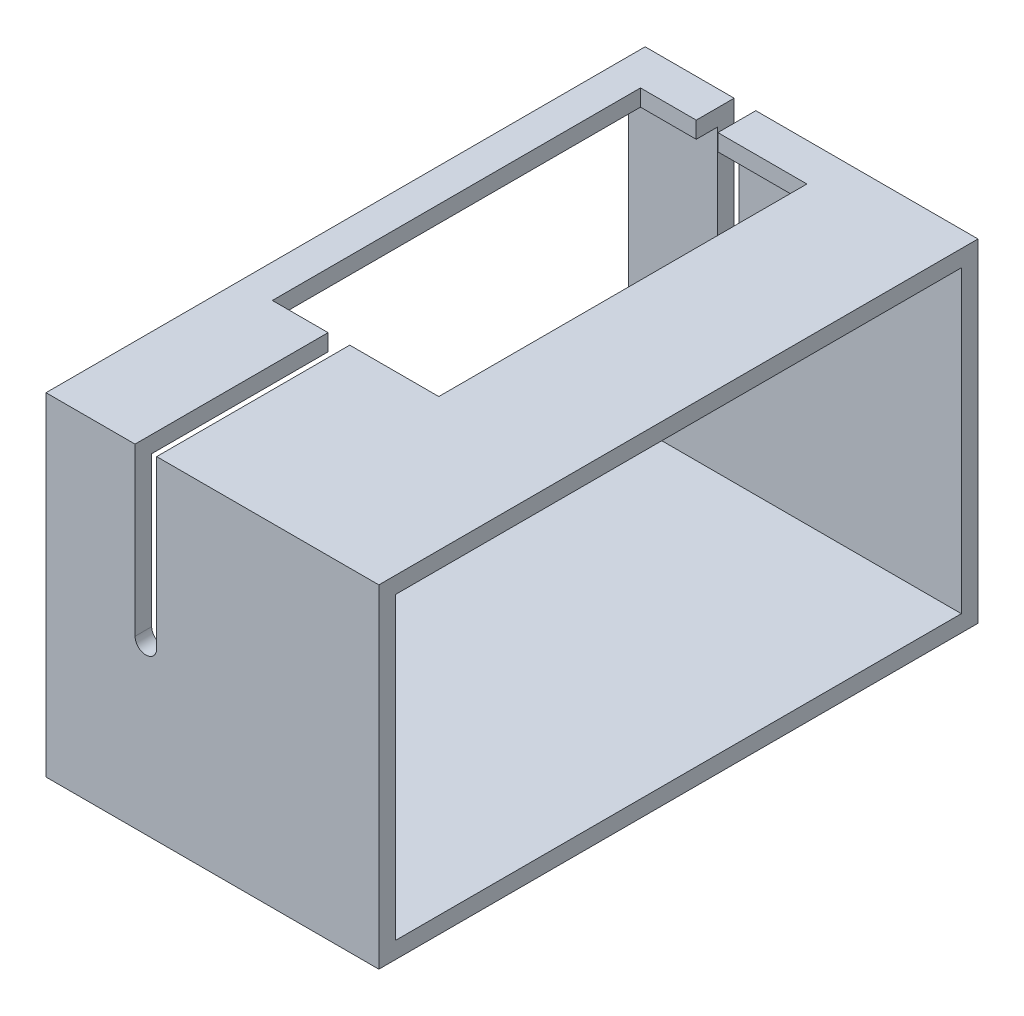
ISO-10303-21;
HEADER;
FILE_DESCRIPTION(('STEP AP214'),'2;1');
FILE_NAME('part.step','',(''),(''),'','','');
FILE_SCHEMA(('AUTOMOTIVE_DESIGN { 1 0 10303 214 1 1 1 1 }'));
ENDSEC;
DATA;
#1=APPLICATION_CONTEXT('core data for automotive mechanical design processes');
#2=APPLICATION_PROTOCOL_DEFINITION('international standard','automotive_design',2000,#1);
#3=PRODUCT_CONTEXT('',#1,'mechanical');
#4=PRODUCT('Part','Part','',(#3));
#5=PRODUCT_RELATED_PRODUCT_CATEGORY('part','',(#4));
#6=PRODUCT_DEFINITION_FORMATION('','',#4);
#7=PRODUCT_DEFINITION_CONTEXT('part definition',#1,'design');
#8=PRODUCT_DEFINITION('design','',#6,#7);
#9=PRODUCT_DEFINITION_SHAPE('','',#8);
#10=(LENGTH_UNIT() NAMED_UNIT(*) SI_UNIT(.MILLI.,.METRE.));
#11=(NAMED_UNIT(*) PLANE_ANGLE_UNIT() SI_UNIT($,.RADIAN.));
#12=(NAMED_UNIT(*) SI_UNIT($,.STERADIAN.) SOLID_ANGLE_UNIT());
#13=UNCERTAINTY_MEASURE_WITH_UNIT(LENGTH_MEASURE(1.E-05),#10,'distance_accuracy_value','');
#14=(GEOMETRIC_REPRESENTATION_CONTEXT(3) GLOBAL_UNCERTAINTY_ASSIGNED_CONTEXT((#13)) GLOBAL_UNIT_ASSIGNED_CONTEXT((#10,
#11,#12)) REPRESENTATION_CONTEXT('',''));
#15=CARTESIAN_POINT('',(0.,0.,0.));
#16=DIRECTION('',(0.,0.,1.));
#17=DIRECTION('',(1.,0.,0.));
#18=AXIS2_PLACEMENT_3D('',#15,#16,#17);
#19=CARTESIAN_POINT('',(0.,50.,0.));
#20=DIRECTION('',(0.,1.,0.));
#21=DIRECTION('',(0.,0.,1.));
#22=AXIS2_PLACEMENT_3D('',#19,#20,#21);
#23=PLANE('',#22);
#24=DIRECTION('',(0.,0.,1.));
#25=VECTOR('',#24,1.);
#26=CARTESIAN_POINT('',(-11.625,50.,-45.));
#27=LINE('',#26,#25);
#28=CARTESIAN_POINT('',(-11.625,50.,-45.));
#29=VERTEX_POINT('',#28);
#30=CARTESIAN_POINT('',(-11.625,50.,-39.3));
#31=VERTEX_POINT('',#30);
#32=EDGE_CURVE('E334',#29,#31,#27,.T.);
#33=ORIENTED_EDGE('',*,*,#32,.F.);
#34=DIRECTION('',(-1.,0.,0.));
#35=VECTOR('',#34,1.);
#36=CARTESIAN_POINT('',(-25.,50.,-45.));
#37=LINE('',#36,#35);
#38=CARTESIAN_POINT('',(-25.,50.,-45.));
#39=VERTEX_POINT('',#38);
#40=EDGE_CURVE('E290',#29,#39,#37,.T.);
#41=ORIENTED_EDGE('',*,*,#40,.T.);
#42=DIRECTION('',(0.,0.,1.));
#43=VECTOR('',#42,1.);
#44=CARTESIAN_POINT('',(-25.,50.,-45.));
#45=LINE('',#44,#43);
#46=CARTESIAN_POINT('',(-25.,50.,45.));
#47=VERTEX_POINT('',#46);
#48=EDGE_CURVE('E295',#39,#47,#45,.T.);
#49=ORIENTED_EDGE('',*,*,#48,.T.);
#50=DIRECTION('',(1.,0.,0.));
#51=VECTOR('',#50,1.);
#52=CARTESIAN_POINT('',(-25.,50.,45.));
#53=LINE('',#52,#51);
#54=CARTESIAN_POINT('',(-11.625,50.,45.));
#55=VERTEX_POINT('',#54);
#56=EDGE_CURVE('E298',#47,#55,#53,.T.);
#57=ORIENTED_EDGE('',*,*,#56,.T.);
#58=CARTESIAN_POINT('',(-11.625,50.,16.));
#59=VERTEX_POINT('',#58);
#60=EDGE_CURVE('E339',#59,#55,#27,.T.);
#61=ORIENTED_EDGE('',*,*,#60,.F.);
#62=DIRECTION('',(1.,0.,0.));
#63=VECTOR('',#62,1.);
#64=CARTESIAN_POINT('',(-20.,50.,16.));
#65=LINE('',#64,#63);
#66=CARTESIAN_POINT('',(-20.,50.,16.));
#67=VERTEX_POINT('',#66);
#68=EDGE_CURVE('E266',#67,#59,#65,.T.);
#69=ORIENTED_EDGE('',*,*,#68,.F.);
#70=DIRECTION('',(0.,0.,1.));
#71=VECTOR('',#70,1.);
#72=CARTESIAN_POINT('',(-20.,50.,-39.3));
#73=LINE('',#72,#71);
#74=CARTESIAN_POINT('',(-20.,50.,-39.3));
#75=VERTEX_POINT('',#74);
#76=EDGE_CURVE('E262',#75,#67,#73,.T.);
#77=ORIENTED_EDGE('',*,*,#76,.F.);
#78=DIRECTION('',(-1.,0.,0.));
#79=VECTOR('',#78,1.);
#80=CARTESIAN_POINT('',(-20.,50.,-39.3));
#81=LINE('',#80,#79);
#82=EDGE_CURVE('E272',#31,#75,#81,.T.);
#83=ORIENTED_EDGE('',*,*,#82,.F.);
#84=EDGE_LOOP('',(#33,#41,#49,#57,#61,#69,#77,#83));
#85=FACE_BOUND('',#84,.T.);
#86=ADVANCED_FACE('F34',(#85),#23,.T.);
#87=CARTESIAN_POINT('',(-20.,40.,-39.3));
#88=DIRECTION('',(0.,0.,-1.));
#89=DIRECTION('',(-1.,0.,0.));
#90=AXIS2_PLACEMENT_3D('',#87,#88,#89);
#91=PLANE('',#90);
#92=DIRECTION('',(1.,0.,0.));
#93=VECTOR('',#92,1.);
#94=CARTESIAN_POINT('',(-20.,47.5,-39.3));
#95=LINE('',#94,#93);
#96=CARTESIAN_POINT('',(-20.,47.5,-39.3));
#97=VERTEX_POINT('',#96);
#98=CARTESIAN_POINT('',(-11.625,47.5,-39.3));
#99=VERTEX_POINT('',#98);
#100=EDGE_CURVE('E256',#97,#99,#95,.T.);
#101=ORIENTED_EDGE('',*,*,#100,.T.);
#102=DIRECTION('',(0.,1.,0.));
#103=VECTOR('',#102,1.);
#104=CARTESIAN_POINT('',(-11.625,40.,-39.3));
#105=LINE('',#104,#103);
#106=EDGE_CURVE('E373',#99,#31,#105,.T.);
#107=ORIENTED_EDGE('',*,*,#106,.T.);
#108=ORIENTED_EDGE('',*,*,#82,.T.);
#109=DIRECTION('',(0.,1.,0.));
#110=VECTOR('',#109,1.);
#111=CARTESIAN_POINT('',(-20.,40.,-39.3));
#112=LINE('',#111,#110);
#113=EDGE_CURVE('E277',#97,#75,#112,.T.);
#114=ORIENTED_EDGE('',*,*,#113,.F.);
#115=EDGE_LOOP('',(#101,#107,#108,#114));
#116=FACE_BOUND('',#115,.T.);
#117=ADVANCED_FACE('F443',(#116),#91,.F.);
#118=CARTESIAN_POINT('',(-20.,40.,16.));
#119=DIRECTION('',(0.,0.,1.));
#120=DIRECTION('',(1.,0.,0.));
#121=AXIS2_PLACEMENT_3D('',#118,#119,#120);
#122=PLANE('',#121);
#123=ORIENTED_EDGE('',*,*,#68,.T.);
#124=DIRECTION('',(0.,-1.,0.));
#125=VECTOR('',#124,1.);
#126=CARTESIAN_POINT('',(-11.625,40.,16.));
#127=LINE('',#126,#125);
#128=CARTESIAN_POINT('',(-11.625,47.5,16.));
#129=VERTEX_POINT('',#128);
#130=EDGE_CURVE('E366',#59,#129,#127,.T.);
#131=ORIENTED_EDGE('',*,*,#130,.T.);
#132=DIRECTION('',(-1.,0.,0.));
#133=VECTOR('',#132,1.);
#134=CARTESIAN_POINT('',(-20.,47.5,16.));
#135=LINE('',#134,#133);
#136=CARTESIAN_POINT('',(-20.,47.5,16.));
#137=VERTEX_POINT('',#136);
#138=EDGE_CURVE('E320',#129,#137,#135,.T.);
#139=ORIENTED_EDGE('',*,*,#138,.T.);
#140=DIRECTION('',(0.,1.,0.));
#141=VECTOR('',#140,1.);
#142=CARTESIAN_POINT('',(-20.,40.,16.));
#143=LINE('',#142,#141);
#144=EDGE_CURVE('E276',#137,#67,#143,.T.);
#145=ORIENTED_EDGE('',*,*,#144,.T.);
#146=EDGE_LOOP('',(#123,#131,#139,#145));
#147=FACE_BOUND('',#146,.T.);
#148=ADVANCED_FACE('F451',(#147),#122,.F.);
#149=CARTESIAN_POINT('',(25.,47.5,-42.5));
#150=DIRECTION('',(0.,1.,0.));
#151=DIRECTION('',(0.,0.,1.));
#152=AXIS2_PLACEMENT_3D('',#149,#150,#151);
#153=PLANE('',#152);
#154=DIRECTION('',(-1.,0.,0.));
#155=VECTOR('',#154,1.);
#156=CARTESIAN_POINT('',(25.,47.5,-42.5));
#157=LINE('',#156,#155);
#158=CARTESIAN_POINT('',(-11.625,47.5,-42.5));
#159=VERTEX_POINT('',#158);
#160=CARTESIAN_POINT('',(-25.,47.5,-42.5));
#161=VERTEX_POINT('',#160);
#162=EDGE_CURVE('E250',#159,#161,#157,.T.);
#163=ORIENTED_EDGE('',*,*,#162,.F.);
#164=DIRECTION('',(0.,0.,1.));
#165=VECTOR('',#164,1.);
#166=CARTESIAN_POINT('',(-11.625,47.5,-42.5));
#167=LINE('',#166,#165);
#168=EDGE_CURVE('E367',#159,#99,#167,.T.);
#169=ORIENTED_EDGE('',*,*,#168,.T.);
#170=ORIENTED_EDGE('',*,*,#100,.F.);
#171=DIRECTION('',(0.,0.,-1.));
#172=VECTOR('',#171,1.);
#173=CARTESIAN_POINT('',(-20.,47.5,-39.3));
#174=LINE('',#173,#172);
#175=EDGE_CURVE('E259',#137,#97,#174,.T.);
#176=ORIENTED_EDGE('',*,*,#175,.F.);
#177=ORIENTED_EDGE('',*,*,#138,.F.);
#178=CARTESIAN_POINT('',(-11.625,47.5,42.5));
#179=VERTEX_POINT('',#178);
#180=EDGE_CURVE('E364',#129,#179,#167,.T.);
#181=ORIENTED_EDGE('',*,*,#180,.T.);
#182=DIRECTION('',(-1.,0.,0.));
#183=VECTOR('',#182,1.);
#184=CARTESIAN_POINT('',(25.,47.5,42.5));
#185=LINE('',#184,#183);
#186=CARTESIAN_POINT('',(-25.,47.5,42.5));
#187=VERTEX_POINT('',#186);
#188=EDGE_CURVE('E227',#179,#187,#185,.T.);
#189=ORIENTED_EDGE('',*,*,#188,.T.);
#190=DIRECTION('',(0.,0.,-1.));
#191=VECTOR('',#190,1.);
#192=CARTESIAN_POINT('',(-25.,47.5,-42.5));
#193=LINE('',#192,#191);
#194=EDGE_CURVE('E234',#187,#161,#193,.T.);
#195=ORIENTED_EDGE('',*,*,#194,.T.);
#196=EDGE_LOOP('',(#163,#169,#170,#176,#177,#181,#189,#195));
#197=FACE_BOUND('',#196,.T.);
#198=ADVANCED_FACE('F410',(#197),#153,.F.);
#199=CARTESIAN_POINT('',(25.,50.,-45.));
#200=DIRECTION('',(-1.,0.,0.));
#201=DIRECTION('',(0.,0.,1.));
#202=AXIS2_PLACEMENT_3D('',#199,#200,#201);
#203=PLANE('',#202);
#204=DIRECTION('',(0.,0.,-1.));
#205=VECTOR('',#204,1.);
#206=CARTESIAN_POINT('',(25.,47.5,-42.5));
#207=LINE('',#206,#205);
#208=CARTESIAN_POINT('',(25.,47.5,42.5));
#209=VERTEX_POINT('',#208);
#210=CARTESIAN_POINT('',(25.,47.5,-42.5));
#211=VERTEX_POINT('',#210);
#212=EDGE_CURVE('E216',#209,#211,#207,.T.);
#213=ORIENTED_EDGE('',*,*,#212,.T.);
#214=DIRECTION('',(0.,-1.,0.));
#215=VECTOR('',#214,1.);
#216=CARTESIAN_POINT('',(25.,47.5,-42.5));
#217=LINE('',#216,#215);
#218=CARTESIAN_POINT('',(25.,2.5,-42.5));
#219=VERTEX_POINT('',#218);
#220=EDGE_CURVE('E232',#211,#219,#217,.T.);
#221=ORIENTED_EDGE('',*,*,#220,.T.);
#222=DIRECTION('',(0.,0.,1.));
#223=VECTOR('',#222,1.);
#224=CARTESIAN_POINT('',(25.,2.5,-42.5));
#225=LINE('',#224,#223);
#226=CARTESIAN_POINT('',(25.,2.5,42.5));
#227=VERTEX_POINT('',#226);
#228=EDGE_CURVE('E217',#219,#227,#225,.T.);
#229=ORIENTED_EDGE('',*,*,#228,.T.);
#230=DIRECTION('',(0.,1.,0.));
#231=VECTOR('',#230,1.);
#232=CARTESIAN_POINT('',(25.,47.5,42.5));
#233=LINE('',#232,#231);
#234=EDGE_CURVE('E202',#227,#209,#233,.T.);
#235=ORIENTED_EDGE('',*,*,#234,.T.);
#236=EDGE_LOOP('',(#213,#221,#229,#235));
#237=FACE_BOUND('',#236,.T.);
#238=DIRECTION('',(0.,0.,-1.));
#239=VECTOR('',#238,1.);
#240=CARTESIAN_POINT('',(25.,0.,-45.));
#241=LINE('',#240,#239);
#242=CARTESIAN_POINT('',(25.,0.,45.));
#243=VERTEX_POINT('',#242);
#244=CARTESIAN_POINT('',(25.,0.,-45.));
#245=VERTEX_POINT('',#244);
#246=EDGE_CURVE('E280',#243,#245,#241,.T.);
#247=ORIENTED_EDGE('',*,*,#246,.T.);
#248=DIRECTION('',(0.,-1.,0.));
#249=VECTOR('',#248,1.);
#250=CARTESIAN_POINT('',(25.,50.,-45.));
#251=LINE('',#250,#249);
#252=CARTESIAN_POINT('',(25.,50.,-45.));
#253=VERTEX_POINT('',#252);
#254=EDGE_CURVE('E317',#253,#245,#251,.T.);
#255=ORIENTED_EDGE('',*,*,#254,.F.);
#256=DIRECTION('',(0.,0.,-1.));
#257=VECTOR('',#256,1.);
#258=CARTESIAN_POINT('',(25.,50.,-45.));
#259=LINE('',#258,#257);
#260=CARTESIAN_POINT('',(25.,50.,45.));
#261=VERTEX_POINT('',#260);
#262=EDGE_CURVE('E287',#261,#253,#259,.T.);
#263=ORIENTED_EDGE('',*,*,#262,.F.);
#264=DIRECTION('',(0.,-1.,0.));
#265=VECTOR('',#264,1.);
#266=CARTESIAN_POINT('',(25.,50.,45.));
#267=LINE('',#266,#265);
#268=EDGE_CURVE('E301',#261,#243,#267,.T.);
#269=ORIENTED_EDGE('',*,*,#268,.T.);
#270=EDGE_LOOP('',(#247,#255,#263,#269));
#271=FACE_BOUND('',#270,.T.);
#272=ADVANCED_FACE('F36',(#237,#271),#203,.F.);
#273=CARTESIAN_POINT('',(-25.,50.,-45.));
#274=DIRECTION('',(0.,0.,1.));
#275=DIRECTION('',(1.,0.,0.));
#276=AXIS2_PLACEMENT_3D('',#273,#274,#275);
#277=PLANE('',#276);
#278=ORIENTED_EDGE('',*,*,#40,.F.);
#279=DIRECTION('',(0.,-1.,0.));
#280=VECTOR('',#279,1.);
#281=CARTESIAN_POINT('',(-11.625,25.,-45.));
#282=LINE('',#281,#280);
#283=CARTESIAN_POINT('',(-11.625,25.,-45.));
#284=VERTEX_POINT('',#283);
#285=EDGE_CURVE('E348',#29,#284,#282,.T.);
#286=ORIENTED_EDGE('',*,*,#285,.T.);
#287=CARTESIAN_POINT('',(-10.,25.,-45.));
#288=DIRECTION('',(0.,0.,1.));
#289=DIRECTION('',(1.,0.,0.));
#290=AXIS2_PLACEMENT_3D('',#287,#288,#289);
#291=CIRCLE('',#290,1.625);
#292=CARTESIAN_POINT('',(-8.375,25.,-45.));
#293=VERTEX_POINT('',#292);
#294=EDGE_CURVE('E397',#284,#293,#291,.T.);
#295=ORIENTED_EDGE('',*,*,#294,.T.);
#296=DIRECTION('',(0.,1.,0.));
#297=VECTOR('',#296,1.);
#298=CARTESIAN_POINT('',(-8.375,25.,-45.));
#299=LINE('',#298,#297);
#300=CARTESIAN_POINT('',(-8.375,50.,-45.));
#301=VERTEX_POINT('',#300);
#302=EDGE_CURVE('E394',#293,#301,#299,.T.);
#303=ORIENTED_EDGE('',*,*,#302,.T.);
#304=EDGE_CURVE('E292',#253,#301,#37,.T.);
#305=ORIENTED_EDGE('',*,*,#304,.F.);
#306=ORIENTED_EDGE('',*,*,#254,.T.);
#307=DIRECTION('',(-1.,0.,0.));
#308=VECTOR('',#307,1.);
#309=CARTESIAN_POINT('',(-25.,0.,-45.));
#310=LINE('',#309,#308);
#311=CARTESIAN_POINT('',(-25.,0.,-45.));
#312=VERTEX_POINT('',#311);
#313=EDGE_CURVE('E304',#245,#312,#310,.T.);
#314=ORIENTED_EDGE('',*,*,#313,.T.);
#315=DIRECTION('',(0.,-1.,0.));
#316=VECTOR('',#315,1.);
#317=CARTESIAN_POINT('',(-25.,50.,-45.));
#318=LINE('',#317,#316);
#319=EDGE_CURVE('E314',#39,#312,#318,.T.);
#320=ORIENTED_EDGE('',*,*,#319,.F.);
#321=EDGE_LOOP('',(#278,#286,#295,#303,#305,#306,#314,#320));
#322=FACE_BOUND('',#321,.T.);
#323=ADVANCED_FACE('F401',(#322),#277,.F.);
#324=CARTESIAN_POINT('',(-25.,50.,-45.));
#325=DIRECTION('',(1.,0.,0.));
#326=DIRECTION('',(0.,0.,-1.));
#327=AXIS2_PLACEMENT_3D('',#324,#325,#326);
#328=PLANE('',#327);
#329=DIRECTION('',(0.,0.,1.));
#330=VECTOR('',#329,1.);
#331=CARTESIAN_POINT('',(-25.,2.5,-42.5));
#332=LINE('',#331,#330);
#333=CARTESIAN_POINT('',(-25.,2.5,-42.5));
#334=VERTEX_POINT('',#333);
#335=CARTESIAN_POINT('',(-25.,2.5,42.5));
#336=VERTEX_POINT('',#335);
#337=EDGE_CURVE('E225',#334,#336,#332,.T.);
#338=ORIENTED_EDGE('',*,*,#337,.F.);
#339=DIRECTION('',(0.,-1.,0.));
#340=VECTOR('',#339,1.);
#341=CARTESIAN_POINT('',(-25.,47.5,-42.5));
#342=LINE('',#341,#340);
#343=EDGE_CURVE('E239',#161,#334,#342,.T.);
#344=ORIENTED_EDGE('',*,*,#343,.F.);
#345=ORIENTED_EDGE('',*,*,#194,.F.);
#346=DIRECTION('',(0.,1.,0.));
#347=VECTOR('',#346,1.);
#348=CARTESIAN_POINT('',(-25.,47.5,42.5));
#349=LINE('',#348,#347);
#350=EDGE_CURVE('E242',#336,#187,#349,.T.);
#351=ORIENTED_EDGE('',*,*,#350,.F.);
#352=EDGE_LOOP('',(#338,#344,#345,#351));
#353=FACE_BOUND('',#352,.T.);
#354=DIRECTION('',(0.,0.,1.));
#355=VECTOR('',#354,1.);
#356=CARTESIAN_POINT('',(-25.,0.,-45.));
#357=LINE('',#356,#355);
#358=CARTESIAN_POINT('',(-25.,0.,45.));
#359=VERTEX_POINT('',#358);
#360=EDGE_CURVE('E306',#312,#359,#357,.T.);
#361=ORIENTED_EDGE('',*,*,#360,.T.);
#362=DIRECTION('',(0.,-1.,0.));
#363=VECTOR('',#362,1.);
#364=CARTESIAN_POINT('',(-25.,50.,45.));
#365=LINE('',#364,#363);
#366=EDGE_CURVE('E311',#47,#359,#365,.T.);
#367=ORIENTED_EDGE('',*,*,#366,.F.);
#368=ORIENTED_EDGE('',*,*,#48,.F.);
#369=ORIENTED_EDGE('',*,*,#319,.T.);
#370=EDGE_LOOP('',(#361,#367,#368,#369));
#371=FACE_BOUND('',#370,.T.);
#372=ADVANCED_FACE('F414',(#353,#371),#328,.F.);
#373=CARTESIAN_POINT('',(-25.,50.,45.));
#374=DIRECTION('',(0.,0.,-1.));
#375=DIRECTION('',(-1.,0.,0.));
#376=AXIS2_PLACEMENT_3D('',#373,#374,#375);
#377=PLANE('',#376);
#378=CARTESIAN_POINT('',(-10.,25.,45.));
#379=DIRECTION('',(0.,0.,1.));
#380=DIRECTION('',(1.,0.,0.));
#381=AXIS2_PLACEMENT_3D('',#378,#379,#380);
#382=CIRCLE('',#381,1.625);
#383=CARTESIAN_POINT('',(-11.625,25.,45.));
#384=VERTEX_POINT('',#383);
#385=CARTESIAN_POINT('',(-8.375,25.,45.));
#386=VERTEX_POINT('',#385);
#387=EDGE_CURVE('E38',#384,#386,#382,.T.);
#388=ORIENTED_EDGE('',*,*,#387,.F.);
#389=DIRECTION('',(0.,1.,0.));
#390=VECTOR('',#389,1.);
#391=CARTESIAN_POINT('',(-11.625,50.,45.));
#392=LINE('',#391,#390);
#393=EDGE_CURVE('E64',#384,#55,#392,.T.);
#394=ORIENTED_EDGE('',*,*,#393,.T.);
#395=ORIENTED_EDGE('',*,*,#56,.F.);
#396=ORIENTED_EDGE('',*,*,#366,.T.);
#397=DIRECTION('',(1.,0.,0.));
#398=VECTOR('',#397,1.);
#399=CARTESIAN_POINT('',(-25.,0.,45.));
#400=LINE('',#399,#398);
#401=EDGE_CURVE('E291',#359,#243,#400,.T.);
#402=ORIENTED_EDGE('',*,*,#401,.T.);
#403=ORIENTED_EDGE('',*,*,#268,.F.);
#404=CARTESIAN_POINT('',(-8.375,50.,45.));
#405=VERTEX_POINT('',#404);
#406=EDGE_CURVE('E297',#405,#261,#53,.T.);
#407=ORIENTED_EDGE('',*,*,#406,.F.);
#408=DIRECTION('',(0.,-1.,0.));
#409=VECTOR('',#408,1.);
#410=CARTESIAN_POINT('',(-8.375,50.,45.));
#411=LINE('',#410,#409);
#412=EDGE_CURVE('E361',#405,#386,#411,.T.);
#413=ORIENTED_EDGE('',*,*,#412,.T.);
#414=EDGE_LOOP('',(#388,#394,#395,#396,#402,#403,#407,#413));
#415=FACE_BOUND('',#414,.T.);
#416=ADVANCED_FACE('F381',(#415),#377,.F.);
#417=DIRECTION('',(0.,0.,1.));
#418=VECTOR('',#417,1.);
#419=CARTESIAN_POINT('',(-8.375,50.,-45.));
#420=LINE('',#419,#418);
#421=CARTESIAN_POINT('',(-8.375,50.,16.));
#422=VERTEX_POINT('',#421);
#423=EDGE_CURVE('E345',#422,#405,#420,.T.);
#424=ORIENTED_EDGE('',*,*,#423,.T.);
#425=ORIENTED_EDGE('',*,*,#406,.T.);
#426=ORIENTED_EDGE('',*,*,#262,.T.);
#427=ORIENTED_EDGE('',*,*,#304,.T.);
#428=CARTESIAN_POINT('',(-8.375,50.,-39.3));
#429=VERTEX_POINT('',#428);
#430=EDGE_CURVE('E389',#301,#429,#420,.T.);
#431=ORIENTED_EDGE('',*,*,#430,.T.);
#432=CARTESIAN_POINT('',(4.99999999999998,50.,-39.3));
#433=VERTEX_POINT('',#432);
#434=EDGE_CURVE('E273',#433,#429,#81,.T.);
#435=ORIENTED_EDGE('',*,*,#434,.F.);
#436=DIRECTION('',(0.,0.,-1.));
#437=VECTOR('',#436,1.);
#438=CARTESIAN_POINT('',(4.99999999999998,50.,-39.3));
#439=LINE('',#438,#437);
#440=CARTESIAN_POINT('',(4.99999999999998,50.,16.));
#441=VERTEX_POINT('',#440);
#442=EDGE_CURVE('E269',#441,#433,#439,.T.);
#443=ORIENTED_EDGE('',*,*,#442,.F.);
#444=EDGE_CURVE('E265',#422,#441,#65,.T.);
#445=ORIENTED_EDGE('',*,*,#444,.F.);
#446=EDGE_LOOP('',(#424,#425,#426,#427,#431,#435,#443,#445));
#447=FACE_BOUND('',#446,.T.);
#448=ADVANCED_FACE('F387',(#447),#23,.T.);
#449=CARTESIAN_POINT('',(0.,0.,0.));
#450=DIRECTION('',(0.,1.,0.));
#451=DIRECTION('',(0.,0.,1.));
#452=AXIS2_PLACEMENT_3D('',#449,#450,#451);
#453=PLANE('',#452);
#454=ORIENTED_EDGE('',*,*,#246,.F.);
#455=ORIENTED_EDGE('',*,*,#401,.F.);
#456=ORIENTED_EDGE('',*,*,#360,.F.);
#457=ORIENTED_EDGE('',*,*,#313,.F.);
#458=EDGE_LOOP('',(#454,#455,#456,#457));
#459=FACE_BOUND('',#458,.T.);
#460=ADVANCED_FACE('F432',(#459),#453,.F.);
#461=CARTESIAN_POINT('',(-20.,40.,-39.3));
#462=DIRECTION('',(-1.,0.,0.));
#463=DIRECTION('',(0.,0.,1.));
#464=AXIS2_PLACEMENT_3D('',#461,#462,#463);
#465=PLANE('',#464);
#466=ORIENTED_EDGE('',*,*,#144,.F.);
#467=ORIENTED_EDGE('',*,*,#175,.T.);
#468=ORIENTED_EDGE('',*,*,#113,.T.);
#469=ORIENTED_EDGE('',*,*,#76,.T.);
#470=EDGE_LOOP('',(#466,#467,#468,#469));
#471=FACE_BOUND('',#470,.T.);
#472=ADVANCED_FACE('F449',(#471),#465,.F.);
#473=ORIENTED_EDGE('',*,*,#434,.T.);
#474=DIRECTION('',(0.,-1.,0.));
#475=VECTOR('',#474,1.);
#476=CARTESIAN_POINT('',(-8.375,40.,-39.3));
#477=LINE('',#476,#475);
#478=CARTESIAN_POINT('',(-8.375,47.5,-39.3));
#479=VERTEX_POINT('',#478);
#480=EDGE_CURVE('E358',#429,#479,#477,.T.);
#481=ORIENTED_EDGE('',*,*,#480,.T.);
#482=CARTESIAN_POINT('',(4.99999999999998,47.5,-39.3));
#483=VERTEX_POINT('',#482);
#484=EDGE_CURVE('E255',#479,#483,#95,.T.);
#485=ORIENTED_EDGE('',*,*,#484,.T.);
#486=DIRECTION('',(0.,1.,0.));
#487=VECTOR('',#486,1.);
#488=CARTESIAN_POINT('',(4.99999999999998,40.,-39.3));
#489=LINE('',#488,#487);
#490=EDGE_CURVE('E281',#483,#433,#489,.T.);
#491=ORIENTED_EDGE('',*,*,#490,.T.);
#492=EDGE_LOOP('',(#473,#481,#485,#491));
#493=FACE_BOUND('',#492,.T.);
#494=ADVANCED_FACE('F423',(#493),#91,.F.);
#495=CARTESIAN_POINT('',(4.99999999999998,40.,-39.3));
#496=DIRECTION('',(1.,0.,0.));
#497=DIRECTION('',(0.,0.,-1.));
#498=AXIS2_PLACEMENT_3D('',#495,#496,#497);
#499=PLANE('',#498);
#500=ORIENTED_EDGE('',*,*,#490,.F.);
#501=DIRECTION('',(0.,0.,1.));
#502=VECTOR('',#501,1.);
#503=CARTESIAN_POINT('',(4.99999999999998,47.5,-39.3));
#504=LINE('',#503,#502);
#505=CARTESIAN_POINT('',(4.99999999999998,47.5,16.));
#506=VERTEX_POINT('',#505);
#507=EDGE_CURVE('E249',#483,#506,#504,.T.);
#508=ORIENTED_EDGE('',*,*,#507,.T.);
#509=DIRECTION('',(0.,1.,0.));
#510=VECTOR('',#509,1.);
#511=CARTESIAN_POINT('',(4.99999999999998,40.,16.));
#512=LINE('',#511,#510);
#513=EDGE_CURVE('E283',#506,#441,#512,.T.);
#514=ORIENTED_EDGE('',*,*,#513,.T.);
#515=ORIENTED_EDGE('',*,*,#442,.T.);
#516=EDGE_LOOP('',(#500,#508,#514,#515));
#517=FACE_BOUND('',#516,.T.);
#518=ADVANCED_FACE('F464',(#517),#499,.F.);
#519=CARTESIAN_POINT('',(-8.375,47.5,16.));
#520=VERTEX_POINT('',#519);
#521=EDGE_CURVE('E321',#506,#520,#135,.T.);
#522=ORIENTED_EDGE('',*,*,#521,.T.);
#523=DIRECTION('',(0.,1.,0.));
#524=VECTOR('',#523,1.);
#525=CARTESIAN_POINT('',(-8.375,40.,16.));
#526=LINE('',#525,#524);
#527=EDGE_CURVE('E351',#520,#422,#526,.T.);
#528=ORIENTED_EDGE('',*,*,#527,.T.);
#529=ORIENTED_EDGE('',*,*,#444,.T.);
#530=ORIENTED_EDGE('',*,*,#513,.F.);
#531=EDGE_LOOP('',(#522,#528,#529,#530));
#532=FACE_BOUND('',#531,.T.);
#533=ADVANCED_FACE('F454',(#532),#122,.F.);
#534=CARTESIAN_POINT('',(-8.375,47.5,42.5));
#535=VERTEX_POINT('',#534);
#536=EDGE_CURVE('E211',#209,#535,#185,.T.);
#537=ORIENTED_EDGE('',*,*,#536,.T.);
#538=DIRECTION('',(0.,0.,-1.));
#539=VECTOR('',#538,1.);
#540=CARTESIAN_POINT('',(-8.375,47.5,-42.5));
#541=LINE('',#540,#539);
#542=EDGE_CURVE('E337',#535,#520,#541,.T.);
#543=ORIENTED_EDGE('',*,*,#542,.T.);
#544=ORIENTED_EDGE('',*,*,#521,.F.);
#545=ORIENTED_EDGE('',*,*,#507,.F.);
#546=ORIENTED_EDGE('',*,*,#484,.F.);
#547=CARTESIAN_POINT('',(-8.375,47.5,-42.5));
#548=VERTEX_POINT('',#547);
#549=EDGE_CURVE('E352',#479,#548,#541,.T.);
#550=ORIENTED_EDGE('',*,*,#549,.T.);
#551=EDGE_CURVE('E246',#211,#548,#157,.T.);
#552=ORIENTED_EDGE('',*,*,#551,.F.);
#553=ORIENTED_EDGE('',*,*,#212,.F.);
#554=EDGE_LOOP('',(#537,#543,#544,#545,#546,#550,#552,#553));
#555=FACE_BOUND('',#554,.T.);
#556=ADVANCED_FACE('F417',(#555),#153,.F.);
#557=CARTESIAN_POINT('',(25.,47.5,-42.5));
#558=DIRECTION('',(0.,0.,-1.));
#559=DIRECTION('',(0.,1.,0.));
#560=AXIS2_PLACEMENT_3D('',#557,#558,#559);
#561=PLANE('',#560);
#562=CARTESIAN_POINT('',(-10.,25.,-42.5));
#563=DIRECTION('',(0.,0.,-1.));
#564=DIRECTION('',(0.,1.,0.));
#565=AXIS2_PLACEMENT_3D('',#562,#563,#564);
#566=CIRCLE('',#565,1.625);
#567=CARTESIAN_POINT('',(-8.375,25.,-42.5));
#568=VERTEX_POINT('',#567);
#569=CARTESIAN_POINT('',(-11.625,25.,-42.5));
#570=VERTEX_POINT('',#569);
#571=EDGE_CURVE('E376',#568,#570,#566,.T.);
#572=ORIENTED_EDGE('',*,*,#571,.T.);
#573=DIRECTION('',(0.,1.,0.));
#574=VECTOR('',#573,1.);
#575=CARTESIAN_POINT('',(-11.625,47.5,-42.5));
#576=LINE('',#575,#574);
#577=EDGE_CURVE('E370',#570,#159,#576,.T.);
#578=ORIENTED_EDGE('',*,*,#577,.T.);
#579=ORIENTED_EDGE('',*,*,#162,.T.);
#580=ORIENTED_EDGE('',*,*,#343,.T.);
#581=DIRECTION('',(-1.,0.,0.));
#582=VECTOR('',#581,1.);
#583=CARTESIAN_POINT('',(25.,2.5,-42.5));
#584=LINE('',#583,#582);
#585=EDGE_CURVE('E228',#219,#334,#584,.T.);
#586=ORIENTED_EDGE('',*,*,#585,.F.);
#587=ORIENTED_EDGE('',*,*,#220,.F.);
#588=ORIENTED_EDGE('',*,*,#551,.T.);
#589=DIRECTION('',(0.,-1.,0.));
#590=VECTOR('',#589,1.);
#591=CARTESIAN_POINT('',(-8.375,47.5,-42.5));
#592=LINE('',#591,#590);
#593=EDGE_CURVE('E355',#548,#568,#592,.T.);
#594=ORIENTED_EDGE('',*,*,#593,.T.);
#595=EDGE_LOOP('',(#572,#578,#579,#580,#586,#587,#588,#594));
#596=FACE_BOUND('',#595,.T.);
#597=ADVANCED_FACE('F408',(#596),#561,.F.);
#598=CARTESIAN_POINT('',(25.,47.5,42.5));
#599=DIRECTION('',(0.,0.,1.));
#600=DIRECTION('',(0.,-1.,0.));
#601=AXIS2_PLACEMENT_3D('',#598,#599,#600);
#602=PLANE('',#601);
#603=ORIENTED_EDGE('',*,*,#188,.F.);
#604=DIRECTION('',(0.,-1.,0.));
#605=VECTOR('',#604,1.);
#606=CARTESIAN_POINT('',(-11.625,47.5,42.5));
#607=LINE('',#606,#605);
#608=CARTESIAN_POINT('',(-11.625,25.,42.5));
#609=VERTEX_POINT('',#608);
#610=EDGE_CURVE('E11',#179,#609,#607,.T.);
#611=ORIENTED_EDGE('',*,*,#610,.T.);
#612=CARTESIAN_POINT('',(-10.,25.,42.5));
#613=DIRECTION('',(0.,0.,1.));
#614=DIRECTION('',(0.,-1.,0.));
#615=AXIS2_PLACEMENT_3D('',#612,#613,#614);
#616=CIRCLE('',#615,1.625);
#617=CARTESIAN_POINT('',(-8.375,25.,42.5));
#618=VERTEX_POINT('',#617);
#619=EDGE_CURVE('E44',#609,#618,#616,.T.);
#620=ORIENTED_EDGE('',*,*,#619,.T.);
#621=DIRECTION('',(0.,1.,0.));
#622=VECTOR('',#621,1.);
#623=CARTESIAN_POINT('',(-8.375,47.5,42.5));
#624=LINE('',#623,#622);
#625=EDGE_CURVE('E324',#618,#535,#624,.T.);
#626=ORIENTED_EDGE('',*,*,#625,.T.);
#627=ORIENTED_EDGE('',*,*,#536,.F.);
#628=ORIENTED_EDGE('',*,*,#234,.F.);
#629=DIRECTION('',(-1.,0.,0.));
#630=VECTOR('',#629,1.);
#631=CARTESIAN_POINT('',(25.,2.5,42.5));
#632=LINE('',#631,#630);
#633=EDGE_CURVE('E207',#227,#336,#632,.T.);
#634=ORIENTED_EDGE('',*,*,#633,.T.);
#635=ORIENTED_EDGE('',*,*,#350,.T.);
#636=EDGE_LOOP('',(#603,#611,#620,#626,#627,#628,#634,#635));
#637=FACE_BOUND('',#636,.T.);
#638=ADVANCED_FACE('F205',(#637),#602,.F.);
#639=CARTESIAN_POINT('',(25.,2.5,-42.5));
#640=DIRECTION('',(0.,-1.,0.));
#641=DIRECTION('',(0.,0.,-1.));
#642=AXIS2_PLACEMENT_3D('',#639,#640,#641);
#643=PLANE('',#642);
#644=ORIENTED_EDGE('',*,*,#337,.T.);
#645=ORIENTED_EDGE('',*,*,#633,.F.);
#646=ORIENTED_EDGE('',*,*,#228,.F.);
#647=ORIENTED_EDGE('',*,*,#585,.T.);
#648=EDGE_LOOP('',(#644,#645,#646,#647));
#649=FACE_BOUND('',#648,.T.);
#650=ADVANCED_FACE('F221',(#649),#643,.F.);
#651=CARTESIAN_POINT('',(-11.625,25.,-45.));
#652=DIRECTION('',(-1.,0.,0.));
#653=DIRECTION('',(0.,0.,1.));
#654=AXIS2_PLACEMENT_3D('',#651,#652,#653);
#655=PLANE('',#654);
#656=DIRECTION('',(0.,0.,1.));
#657=VECTOR('',#656,1.);
#658=CARTESIAN_POINT('',(-11.625,25.,-45.));
#659=LINE('',#658,#657);
#660=EDGE_CURVE('E329',#609,#384,#659,.T.);
#661=ORIENTED_EDGE('',*,*,#660,.F.);
#662=ORIENTED_EDGE('',*,*,#610,.F.);
#663=ORIENTED_EDGE('',*,*,#180,.F.);
#664=ORIENTED_EDGE('',*,*,#130,.F.);
#665=ORIENTED_EDGE('',*,*,#60,.T.);
#666=ORIENTED_EDGE('',*,*,#393,.F.);
#667=EDGE_LOOP('',(#661,#662,#663,#664,#665,#666));
#668=FACE_BOUND('',#667,.T.);
#669=ADVANCED_FACE('F331',(#668),#655,.F.);
#670=CARTESIAN_POINT('',(-8.375,25.,-45.));
#671=DIRECTION('',(1.,0.,0.));
#672=DIRECTION('',(0.,0.,-1.));
#673=AXIS2_PLACEMENT_3D('',#670,#671,#672);
#674=PLANE('',#673);
#675=ORIENTED_EDGE('',*,*,#423,.F.);
#676=ORIENTED_EDGE('',*,*,#527,.F.);
#677=ORIENTED_EDGE('',*,*,#542,.F.);
#678=ORIENTED_EDGE('',*,*,#625,.F.);
#679=DIRECTION('',(0.,0.,1.));
#680=VECTOR('',#679,1.);
#681=CARTESIAN_POINT('',(-8.375,25.,-45.));
#682=LINE('',#681,#680);
#683=EDGE_CURVE('E72',#618,#386,#682,.T.);
#684=ORIENTED_EDGE('',*,*,#683,.T.);
#685=ORIENTED_EDGE('',*,*,#412,.F.);
#686=EDGE_LOOP('',(#675,#676,#677,#678,#684,#685));
#687=FACE_BOUND('',#686,.T.);
#688=ADVANCED_FACE('F384',(#687),#674,.F.);
#689=CARTESIAN_POINT('',(-10.,25.,-45.));
#690=DIRECTION('',(0.,0.,1.));
#691=DIRECTION('',(1.,0.,0.));
#692=AXIS2_PLACEMENT_3D('',#689,#690,#691);
#693=CYLINDRICAL_SURFACE('',#692,1.625);
#694=ORIENTED_EDGE('',*,*,#683,.F.);
#695=ORIENTED_EDGE('',*,*,#619,.F.);
#696=ORIENTED_EDGE('',*,*,#660,.T.);
#697=ORIENTED_EDGE('',*,*,#387,.T.);
#698=EDGE_LOOP('',(#694,#695,#696,#697));
#699=FACE_BOUND('',#698,.T.);
#700=ADVANCED_FACE('F328',(#699),#693,.F.);
#701=EDGE_CURVE('E52',#293,#568,#682,.T.);
#702=ORIENTED_EDGE('',*,*,#701,.F.);
#703=ORIENTED_EDGE('',*,*,#294,.F.);
#704=EDGE_CURVE('E333',#284,#570,#659,.T.);
#705=ORIENTED_EDGE('',*,*,#704,.T.);
#706=ORIENTED_EDGE('',*,*,#571,.F.);
#707=EDGE_LOOP('',(#702,#703,#705,#706));
#708=FACE_BOUND('',#707,.T.);
#709=ADVANCED_FACE('F402',(#708),#693,.F.);
#710=ORIENTED_EDGE('',*,*,#168,.F.);
#711=ORIENTED_EDGE('',*,*,#577,.F.);
#712=ORIENTED_EDGE('',*,*,#704,.F.);
#713=ORIENTED_EDGE('',*,*,#285,.F.);
#714=ORIENTED_EDGE('',*,*,#32,.T.);
#715=ORIENTED_EDGE('',*,*,#106,.F.);
#716=EDGE_LOOP('',(#710,#711,#712,#713,#714,#715));
#717=FACE_BOUND('',#716,.T.);
#718=ADVANCED_FACE('F404',(#717),#655,.F.);
#719=ORIENTED_EDGE('',*,*,#430,.F.);
#720=ORIENTED_EDGE('',*,*,#302,.F.);
#721=ORIENTED_EDGE('',*,*,#701,.T.);
#722=ORIENTED_EDGE('',*,*,#593,.F.);
#723=ORIENTED_EDGE('',*,*,#549,.F.);
#724=ORIENTED_EDGE('',*,*,#480,.F.);
#725=EDGE_LOOP('',(#719,#720,#721,#722,#723,#724));
#726=FACE_BOUND('',#725,.T.);
#727=ADVANCED_FACE('F421',(#726),#674,.F.);
#728=CLOSED_SHELL('',(#86,#117,#148,#198,#272,#323,#372,#416,#448,#460,#472,#494,#518,#533,#556,
#597,#638,#650,#669,#688,#700,#709,#718,#727));
#729=MANIFOLD_SOLID_BREP('B2',#728);
#730=ADVANCED_BREP_SHAPE_REPRESENTATION('',(#18,#729),#14);
#731=SHAPE_DEFINITION_REPRESENTATION(#9,#730);
ENDSEC;
END-ISO-10303-21;
